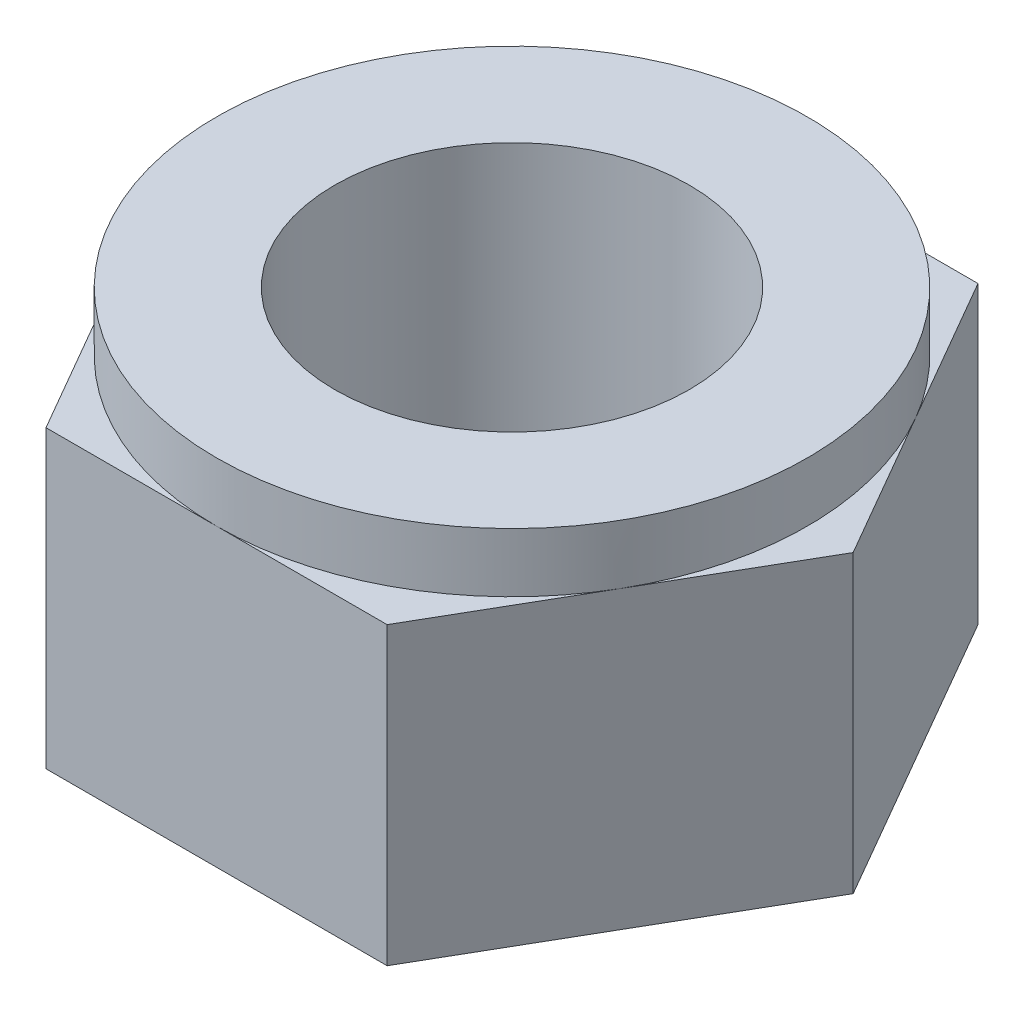
ISO-10303-21;
HEADER;
FILE_DESCRIPTION(('STEP AP214'),'2;1');
FILE_NAME('part.step','',(''),(''),'','','');
FILE_SCHEMA(('AUTOMOTIVE_DESIGN { 1 0 10303 214 1 1 1 1 }'));
ENDSEC;
DATA;
#1=APPLICATION_CONTEXT('core data for automotive mechanical design processes');
#2=APPLICATION_PROTOCOL_DEFINITION('international standard','automotive_design',2000,#1);
#3=PRODUCT_CONTEXT('',#1,'mechanical');
#4=PRODUCT('Part','Part','',(#3));
#5=PRODUCT_RELATED_PRODUCT_CATEGORY('part','',(#4));
#6=PRODUCT_DEFINITION_FORMATION('','',#4);
#7=PRODUCT_DEFINITION_CONTEXT('part definition',#1,'design');
#8=PRODUCT_DEFINITION('design','',#6,#7);
#9=PRODUCT_DEFINITION_SHAPE('','',#8);
#10=(LENGTH_UNIT() NAMED_UNIT(*) SI_UNIT(.MILLI.,.METRE.));
#11=(NAMED_UNIT(*) PLANE_ANGLE_UNIT() SI_UNIT($,.RADIAN.));
#12=(NAMED_UNIT(*) SI_UNIT($,.STERADIAN.) SOLID_ANGLE_UNIT());
#13=UNCERTAINTY_MEASURE_WITH_UNIT(LENGTH_MEASURE(1.E-05),#10,'distance_accuracy_value','');
#14=(GEOMETRIC_REPRESENTATION_CONTEXT(3) GLOBAL_UNCERTAINTY_ASSIGNED_CONTEXT((#13)) GLOBAL_UNIT_ASSIGNED_CONTEXT((#10,
#11,#12)) REPRESENTATION_CONTEXT('',''));
#15=CARTESIAN_POINT('',(0.,0.,0.));
#16=DIRECTION('',(0.,0.,1.));
#17=DIRECTION('',(1.,0.,0.));
#18=AXIS2_PLACEMENT_3D('',#15,#16,#17);
#19=CARTESIAN_POINT('',(0.,5.,0.));
#20=DIRECTION('',(0.,1.,0.));
#21=DIRECTION('',(0.,0.,1.));
#22=AXIS2_PLACEMENT_3D('',#19,#20,#21);
#23=PLANE('',#22);
#24=CARTESIAN_POINT('',(0.,5.,0.));
#25=DIRECTION('',(0.,1.,0.));
#26=DIRECTION('',(0.,0.,1.));
#27=AXIS2_PLACEMENT_3D('',#24,#25,#26);
#28=CIRCLE('',#27,5.);
#29=CARTESIAN_POINT('',(0.,5.,5.));
#30=VERTEX_POINT('',#29);
#31=CARTESIAN_POINT('',(4.3301270189222,5.,2.5));
#32=VERTEX_POINT('',#31);
#33=EDGE_CURVE('E55',#30,#32,#28,.T.);
#34=ORIENTED_EDGE('',*,*,#33,.F.);
#35=DIRECTION('',(1.,0.,0.));
#36=VECTOR('',#35,1.);
#37=CARTESIAN_POINT('',(-2.88675134594813,5.,5.));
#38=LINE('',#37,#36);
#39=CARTESIAN_POINT('',(2.88675134594813,5.,5.));
#40=VERTEX_POINT('',#39);
#41=EDGE_CURVE('E126',#30,#40,#38,.T.);
#42=ORIENTED_EDGE('',*,*,#41,.T.);
#43=DIRECTION('',(0.5,0.,-0.866025403784439));
#44=VECTOR('',#43,1.);
#45=CARTESIAN_POINT('',(2.88675134594813,5.,5.));
#46=LINE('',#45,#44);
#47=EDGE_CURVE('E138',#40,#32,#46,.T.);
#48=ORIENTED_EDGE('',*,*,#47,.T.);
#49=EDGE_LOOP('',(#34,#42,#48));
#50=FACE_BOUND('',#49,.T.);
#51=ADVANCED_FACE('F43',(#50),#23,.T.);
#52=CARTESIAN_POINT('',(4.3301270189222,5.,-2.5));
#53=VERTEX_POINT('',#52);
#54=EDGE_CURVE('E11',#32,#53,#28,.T.);
#55=ORIENTED_EDGE('',*,*,#54,.F.);
#56=CARTESIAN_POINT('',(5.77350269189626,5.,0.));
#57=VERTEX_POINT('',#56);
#58=EDGE_CURVE('E157',#32,#57,#46,.T.);
#59=ORIENTED_EDGE('',*,*,#58,.T.);
#60=DIRECTION('',(-0.5,0.,-0.866025403784438));
#61=VECTOR('',#60,1.);
#62=CARTESIAN_POINT('',(5.77350269189626,5.,0.));
#63=LINE('',#62,#61);
#64=EDGE_CURVE('E158',#57,#53,#63,.T.);
#65=ORIENTED_EDGE('',*,*,#64,.T.);
#66=EDGE_LOOP('',(#55,#59,#65));
#67=FACE_BOUND('',#66,.T.);
#68=ADVANCED_FACE('F259',(#67),#23,.T.);
#69=CARTESIAN_POINT('',(0.,5.,-5.));
#70=VERTEX_POINT('',#69);
#71=EDGE_CURVE('E53',#53,#70,#28,.T.);
#72=ORIENTED_EDGE('',*,*,#71,.F.);
#73=CARTESIAN_POINT('',(2.88675134594813,5.,-5.));
#74=VERTEX_POINT('',#73);
#75=EDGE_CURVE('E156',#53,#74,#63,.T.);
#76=ORIENTED_EDGE('',*,*,#75,.T.);
#77=DIRECTION('',(-1.,0.,0.));
#78=VECTOR('',#77,1.);
#79=CARTESIAN_POINT('',(2.88675134594813,5.,-5.));
#80=LINE('',#79,#78);
#81=EDGE_CURVE('E163',#74,#70,#80,.T.);
#82=ORIENTED_EDGE('',*,*,#81,.T.);
#83=EDGE_LOOP('',(#72,#76,#82));
#84=FACE_BOUND('',#83,.T.);
#85=ADVANCED_FACE('F263',(#84),#23,.T.);
#86=CARTESIAN_POINT('',(-4.33012701892219,5.,-2.5));
#87=VERTEX_POINT('',#86);
#88=EDGE_CURVE('E148',#70,#87,#28,.T.);
#89=ORIENTED_EDGE('',*,*,#88,.F.);
#90=CARTESIAN_POINT('',(-2.88675134594813,5.,-5.));
#91=VERTEX_POINT('',#90);
#92=EDGE_CURVE('E162',#70,#91,#80,.T.);
#93=ORIENTED_EDGE('',*,*,#92,.T.);
#94=DIRECTION('',(-0.5,0.,0.866025403784439));
#95=VECTOR('',#94,1.);
#96=CARTESIAN_POINT('',(-2.88675134594813,5.,-5.));
#97=LINE('',#96,#95);
#98=EDGE_CURVE('E168',#91,#87,#97,.T.);
#99=ORIENTED_EDGE('',*,*,#98,.T.);
#100=EDGE_LOOP('',(#89,#93,#99));
#101=FACE_BOUND('',#100,.T.);
#102=ADVANCED_FACE('F310',(#101),#23,.T.);
#103=CARTESIAN_POINT('',(-4.33012701892219,5.,2.5));
#104=VERTEX_POINT('',#103);
#105=EDGE_CURVE('E70',#87,#104,#28,.T.);
#106=ORIENTED_EDGE('',*,*,#105,.F.);
#107=CARTESIAN_POINT('',(-5.77350269189626,5.,0.));
#108=VERTEX_POINT('',#107);
#109=EDGE_CURVE('E167',#87,#108,#97,.T.);
#110=ORIENTED_EDGE('',*,*,#109,.T.);
#111=DIRECTION('',(0.5,0.,0.866025403784438));
#112=VECTOR('',#111,1.);
#113=CARTESIAN_POINT('',(-5.77350269189626,5.,0.));
#114=LINE('',#113,#112);
#115=EDGE_CURVE('E136',#108,#104,#114,.T.);
#116=ORIENTED_EDGE('',*,*,#115,.T.);
#117=EDGE_LOOP('',(#106,#110,#116));
#118=FACE_BOUND('',#117,.T.);
#119=ADVANCED_FACE('F229',(#118),#23,.T.);
#120=CARTESIAN_POINT('',(2.88675134594813,5.,5.));
#121=DIRECTION('',(-0.866025403784439,0.,-0.5));
#122=DIRECTION('',(-0.5,0.,0.866025403784439));
#123=AXIS2_PLACEMENT_3D('',#120,#121,#122);
#124=PLANE('',#123);
#125=DIRECTION('',(0.5,0.,-0.866025403784439));
#126=VECTOR('',#125,1.);
#127=CARTESIAN_POINT('',(2.88675134594813,0.,5.));
#128=LINE('',#127,#126);
#129=CARTESIAN_POINT('',(2.88675134594813,0.,5.));
#130=VERTEX_POINT('',#129);
#131=CARTESIAN_POINT('',(5.77350269189626,0.,0.));
#132=VERTEX_POINT('',#131);
#133=EDGE_CURVE('E174',#130,#132,#128,.T.);
#134=ORIENTED_EDGE('',*,*,#133,.T.);
#135=DIRECTION('',(0.,-1.,0.));
#136=VECTOR('',#135,1.);
#137=CARTESIAN_POINT('',(5.77350269189626,5.,0.));
#138=LINE('',#137,#136);
#139=EDGE_CURVE('E47',#57,#132,#138,.T.);
#140=ORIENTED_EDGE('',*,*,#139,.F.);
#141=ORIENTED_EDGE('',*,*,#58,.F.);
#142=ORIENTED_EDGE('',*,*,#47,.F.);
#143=DIRECTION('',(0.,-1.,0.));
#144=VECTOR('',#143,1.);
#145=CARTESIAN_POINT('',(2.88675134594813,5.,5.));
#146=LINE('',#145,#144);
#147=EDGE_CURVE('E125',#40,#130,#146,.T.);
#148=ORIENTED_EDGE('',*,*,#147,.T.);
#149=EDGE_LOOP('',(#134,#140,#141,#142,#148));
#150=FACE_BOUND('',#149,.T.);
#151=ADVANCED_FACE('F45',(#150),#124,.F.);
#152=CARTESIAN_POINT('',(5.77350269189626,5.,0.));
#153=DIRECTION('',(-0.866025403784438,0.,0.5));
#154=DIRECTION('',(0.5,0.,0.866025403784438));
#155=AXIS2_PLACEMENT_3D('',#152,#153,#154);
#156=PLANE('',#155);
#157=DIRECTION('',(-0.5,0.,-0.866025403784438));
#158=VECTOR('',#157,1.);
#159=CARTESIAN_POINT('',(5.77350269189626,0.,0.));
#160=LINE('',#159,#158);
#161=CARTESIAN_POINT('',(2.88675134594813,0.,-5.));
#162=VERTEX_POINT('',#161);
#163=EDGE_CURVE('E178',#132,#162,#160,.T.);
#164=ORIENTED_EDGE('',*,*,#163,.T.);
#165=DIRECTION('',(0.,-1.,0.));
#166=VECTOR('',#165,1.);
#167=CARTESIAN_POINT('',(2.88675134594813,5.,-5.));
#168=LINE('',#167,#166);
#169=EDGE_CURVE('E150',#74,#162,#168,.T.);
#170=ORIENTED_EDGE('',*,*,#169,.F.);
#171=ORIENTED_EDGE('',*,*,#75,.F.);
#172=ORIENTED_EDGE('',*,*,#64,.F.);
#173=ORIENTED_EDGE('',*,*,#139,.T.);
#174=EDGE_LOOP('',(#164,#170,#171,#172,#173));
#175=FACE_BOUND('',#174,.T.);
#176=ADVANCED_FACE('F360',(#175),#156,.F.);
#177=CARTESIAN_POINT('',(2.88675134594813,5.,-5.));
#178=DIRECTION('',(0.,0.,1.));
#179=DIRECTION('',(1.,0.,0.));
#180=AXIS2_PLACEMENT_3D('',#177,#178,#179);
#181=PLANE('',#180);
#182=DIRECTION('',(-1.,0.,0.));
#183=VECTOR('',#182,1.);
#184=CARTESIAN_POINT('',(2.88675134594813,0.,-5.));
#185=LINE('',#184,#183);
#186=CARTESIAN_POINT('',(-2.88675134594813,0.,-5.));
#187=VERTEX_POINT('',#186);
#188=EDGE_CURVE('E181',#162,#187,#185,.T.);
#189=ORIENTED_EDGE('',*,*,#188,.T.);
#190=DIRECTION('',(0.,-1.,0.));
#191=VECTOR('',#190,1.);
#192=CARTESIAN_POINT('',(-2.88675134594813,5.,-5.));
#193=LINE('',#192,#191);
#194=EDGE_CURVE('E202',#91,#187,#193,.T.);
#195=ORIENTED_EDGE('',*,*,#194,.F.);
#196=ORIENTED_EDGE('',*,*,#92,.F.);
#197=ORIENTED_EDGE('',*,*,#81,.F.);
#198=ORIENTED_EDGE('',*,*,#169,.T.);
#199=EDGE_LOOP('',(#189,#195,#196,#197,#198));
#200=FACE_BOUND('',#199,.T.);
#201=ADVANCED_FACE('F211',(#200),#181,.F.);
#202=CARTESIAN_POINT('',(-2.88675134594813,5.,-5.));
#203=DIRECTION('',(0.866025403784438,0.,0.5));
#204=DIRECTION('',(0.5,0.,-0.866025403784439));
#205=AXIS2_PLACEMENT_3D('',#202,#203,#204);
#206=PLANE('',#205);
#207=DIRECTION('',(-0.5,0.,0.866025403784439));
#208=VECTOR('',#207,1.);
#209=CARTESIAN_POINT('',(-2.88675134594813,0.,-5.));
#210=LINE('',#209,#208);
#211=CARTESIAN_POINT('',(-5.77350269189626,0.,0.));
#212=VERTEX_POINT('',#211);
#213=EDGE_CURVE('E184',#187,#212,#210,.T.);
#214=ORIENTED_EDGE('',*,*,#213,.T.);
#215=DIRECTION('',(0.,-1.,0.));
#216=VECTOR('',#215,1.);
#217=CARTESIAN_POINT('',(-5.77350269189626,5.,0.));
#218=LINE('',#217,#216);
#219=EDGE_CURVE('E198',#108,#212,#218,.T.);
#220=ORIENTED_EDGE('',*,*,#219,.F.);
#221=ORIENTED_EDGE('',*,*,#109,.F.);
#222=ORIENTED_EDGE('',*,*,#98,.F.);
#223=ORIENTED_EDGE('',*,*,#194,.T.);
#224=EDGE_LOOP('',(#214,#220,#221,#222,#223));
#225=FACE_BOUND('',#224,.T.);
#226=ADVANCED_FACE('F224',(#225),#206,.F.);
#227=CARTESIAN_POINT('',(-5.77350269189626,5.,0.));
#228=DIRECTION('',(0.866025403784438,0.,-0.5));
#229=DIRECTION('',(-0.5,0.,-0.866025403784439));
#230=AXIS2_PLACEMENT_3D('',#227,#228,#229);
#231=PLANE('',#230);
#232=DIRECTION('',(0.5,0.,0.866025403784438));
#233=VECTOR('',#232,1.);
#234=CARTESIAN_POINT('',(-5.77350269189626,0.,0.));
#235=LINE('',#234,#233);
#236=CARTESIAN_POINT('',(-2.88675134594813,0.,5.));
#237=VERTEX_POINT('',#236);
#238=EDGE_CURVE('E187',#212,#237,#235,.T.);
#239=ORIENTED_EDGE('',*,*,#238,.T.);
#240=DIRECTION('',(0.,-1.,0.));
#241=VECTOR('',#240,1.);
#242=CARTESIAN_POINT('',(-2.88675134594813,5.,5.));
#243=LINE('',#242,#241);
#244=CARTESIAN_POINT('',(-2.88675134594813,5.,5.));
#245=VERTEX_POINT('',#244);
#246=EDGE_CURVE('E195',#245,#237,#243,.T.);
#247=ORIENTED_EDGE('',*,*,#246,.F.);
#248=EDGE_CURVE('E120',#104,#245,#114,.T.);
#249=ORIENTED_EDGE('',*,*,#248,.F.);
#250=ORIENTED_EDGE('',*,*,#115,.F.);
#251=ORIENTED_EDGE('',*,*,#219,.T.);
#252=EDGE_LOOP('',(#239,#247,#249,#250,#251));
#253=FACE_BOUND('',#252,.T.);
#254=ADVANCED_FACE('F228',(#253),#231,.F.);
#255=CARTESIAN_POINT('',(-2.88675134594813,5.,5.));
#256=DIRECTION('',(0.,0.,-1.));
#257=DIRECTION('',(-1.,0.,0.));
#258=AXIS2_PLACEMENT_3D('',#255,#256,#257);
#259=PLANE('',#258);
#260=DIRECTION('',(1.,0.,0.));
#261=VECTOR('',#260,1.);
#262=CARTESIAN_POINT('',(-2.88675134594813,0.,5.));
#263=LINE('',#262,#261);
#264=EDGE_CURVE('E190',#237,#130,#263,.T.);
#265=ORIENTED_EDGE('',*,*,#264,.T.);
#266=ORIENTED_EDGE('',*,*,#147,.F.);
#267=ORIENTED_EDGE('',*,*,#41,.F.);
#268=EDGE_CURVE('E117',#245,#30,#38,.T.);
#269=ORIENTED_EDGE('',*,*,#268,.F.);
#270=ORIENTED_EDGE('',*,*,#246,.T.);
#271=EDGE_LOOP('',(#265,#266,#267,#269,#270));
#272=FACE_BOUND('',#271,.T.);
#273=ADVANCED_FACE('F130',(#272),#259,.F.);
#274=EDGE_CURVE('E62',#104,#30,#28,.T.);
#275=ORIENTED_EDGE('',*,*,#274,.F.);
#276=ORIENTED_EDGE('',*,*,#248,.T.);
#277=ORIENTED_EDGE('',*,*,#268,.T.);
#278=EDGE_LOOP('',(#275,#276,#277));
#279=FACE_BOUND('',#278,.T.);
#280=ADVANCED_FACE('F119',(#279),#23,.T.);
#281=CARTESIAN_POINT('',(0.,0.,0.));
#282=DIRECTION('',(0.,1.,0.));
#283=DIRECTION('',(0.,0.,1.));
#284=AXIS2_PLACEMENT_3D('',#281,#282,#283);
#285=PLANE('',#284);
#286=CARTESIAN_POINT('',(0.,0.,0.));
#287=DIRECTION('',(0.,-1.,0.));
#288=DIRECTION('',(0.,0.,-1.));
#289=AXIS2_PLACEMENT_3D('',#286,#287,#288);
#290=CIRCLE('',#289,3.);
#291=CARTESIAN_POINT('',(0.,0.,-3.));
#292=VERTEX_POINT('',#291);
#293=EDGE_CURVE('E240',#292,#292,#290,.T.);
#294=ORIENTED_EDGE('',*,*,#293,.F.);
#295=EDGE_LOOP('',(#294));
#296=FACE_BOUND('',#295,.T.);
#297=ORIENTED_EDGE('',*,*,#133,.F.);
#298=ORIENTED_EDGE('',*,*,#264,.F.);
#299=ORIENTED_EDGE('',*,*,#238,.F.);
#300=ORIENTED_EDGE('',*,*,#213,.F.);
#301=ORIENTED_EDGE('',*,*,#188,.F.);
#302=ORIENTED_EDGE('',*,*,#163,.F.);
#303=EDGE_LOOP('',(#297,#298,#299,#300,#301,#302));
#304=FACE_BOUND('',#303,.T.);
#305=ADVANCED_FACE('F219',(#296,#304),#285,.F.);
#306=CARTESIAN_POINT('',(0.,6.,0.));
#307=DIRECTION('',(0.,-1.,0.));
#308=DIRECTION('',(0.,0.,-1.));
#309=AXIS2_PLACEMENT_3D('',#306,#307,#308);
#310=CYLINDRICAL_SURFACE('',#309,5.);
#311=CARTESIAN_POINT('',(0.,6.,0.));
#312=DIRECTION('',(0.,1.,0.));
#313=DIRECTION('',(0.,0.,1.));
#314=AXIS2_PLACEMENT_3D('',#311,#312,#313);
#315=CIRCLE('',#314,5.);
#316=CARTESIAN_POINT('',(0.,6.,5.));
#317=VERTEX_POINT('',#316);
#318=EDGE_CURVE('E141',#317,#317,#315,.T.);
#319=ORIENTED_EDGE('',*,*,#318,.F.);
#320=EDGE_LOOP('',(#319));
#321=FACE_BOUND('',#320,.T.);
#322=ORIENTED_EDGE('',*,*,#33,.T.);
#323=ORIENTED_EDGE('',*,*,#54,.T.);
#324=ORIENTED_EDGE('',*,*,#71,.T.);
#325=ORIENTED_EDGE('',*,*,#88,.T.);
#326=ORIENTED_EDGE('',*,*,#105,.T.);
#327=ORIENTED_EDGE('',*,*,#274,.T.);
#328=EDGE_LOOP('',(#322,#323,#324,#325,#326,#327));
#329=FACE_BOUND('',#328,.T.);
#330=ADVANCED_FACE('F143',(#321,#329),#310,.T.);
#331=CARTESIAN_POINT('',(0.,6.,0.));
#332=DIRECTION('',(0.,1.,0.));
#333=DIRECTION('',(0.,0.,1.));
#334=AXIS2_PLACEMENT_3D('',#331,#332,#333);
#335=PLANE('',#334);
#336=CARTESIAN_POINT('',(0.,6.,0.));
#337=DIRECTION('',(0.,-1.,0.));
#338=DIRECTION('',(0.,0.,-1.));
#339=AXIS2_PLACEMENT_3D('',#336,#337,#338);
#340=CIRCLE('',#339,3.);
#341=CARTESIAN_POINT('',(0.,6.,-3.));
#342=VERTEX_POINT('',#341);
#343=EDGE_CURVE('E142',#342,#342,#340,.T.);
#344=ORIENTED_EDGE('',*,*,#343,.T.);
#345=EDGE_LOOP('',(#344));
#346=FACE_BOUND('',#345,.T.);
#347=ORIENTED_EDGE('',*,*,#318,.T.);
#348=EDGE_LOOP('',(#347));
#349=FACE_BOUND('',#348,.T.);
#350=ADVANCED_FACE('F253',(#346,#349),#335,.T.);
#351=CARTESIAN_POINT('',(0.,6.,0.));
#352=DIRECTION('',(0.,-1.,0.));
#353=DIRECTION('',(0.,0.,-1.));
#354=AXIS2_PLACEMENT_3D('',#351,#352,#353);
#355=CYLINDRICAL_SURFACE('',#354,3.);
#356=ORIENTED_EDGE('',*,*,#343,.F.);
#357=EDGE_LOOP('',(#356));
#358=FACE_BOUND('',#357,.T.);
#359=ORIENTED_EDGE('',*,*,#293,.T.);
#360=EDGE_LOOP('',(#359));
#361=FACE_BOUND('',#360,.T.);
#362=ADVANCED_FACE('F245',(#358,#361),#355,.F.);
#363=CLOSED_SHELL('',(#51,#68,#85,#102,#119,#151,#176,#201,#226,#254,#273,#280,#305,#330,#350,#362));
#364=MANIFOLD_SOLID_BREP('B2',#363);
#365=ADVANCED_BREP_SHAPE_REPRESENTATION('',(#18,#364),#14);
#366=SHAPE_DEFINITION_REPRESENTATION(#9,#365);
ENDSEC;
END-ISO-10303-21;
